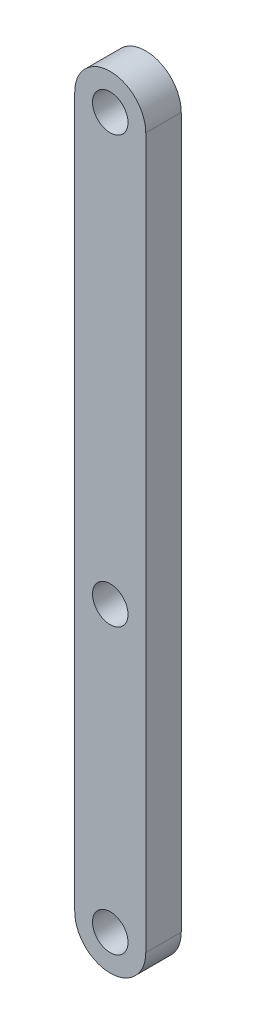
ISO-10303-21;
HEADER;
FILE_DESCRIPTION(('STEP AP214'),'2;1');
FILE_NAME('part.step','',(''),(''),'','','');
FILE_SCHEMA(('AUTOMOTIVE_DESIGN { 1 0 10303 214 1 1 1 1 }'));
ENDSEC;
DATA;
#1=APPLICATION_CONTEXT('core data for automotive mechanical design processes');
#2=APPLICATION_PROTOCOL_DEFINITION('international standard','automotive_design',2000,#1);
#3=PRODUCT_CONTEXT('',#1,'mechanical');
#4=PRODUCT('Part','Part','',(#3));
#5=PRODUCT_RELATED_PRODUCT_CATEGORY('part','',(#4));
#6=PRODUCT_DEFINITION_FORMATION('','',#4);
#7=PRODUCT_DEFINITION_CONTEXT('part definition',#1,'design');
#8=PRODUCT_DEFINITION('design','',#6,#7);
#9=PRODUCT_DEFINITION_SHAPE('','',#8);
#10=(LENGTH_UNIT() NAMED_UNIT(*) SI_UNIT(.MILLI.,.METRE.));
#11=(NAMED_UNIT(*) PLANE_ANGLE_UNIT() SI_UNIT($,.RADIAN.));
#12=(NAMED_UNIT(*) SI_UNIT($,.STERADIAN.) SOLID_ANGLE_UNIT());
#13=UNCERTAINTY_MEASURE_WITH_UNIT(LENGTH_MEASURE(1.E-05),#10,'distance_accuracy_value','');
#14=(GEOMETRIC_REPRESENTATION_CONTEXT(3) GLOBAL_UNCERTAINTY_ASSIGNED_CONTEXT((#13)) GLOBAL_UNIT_ASSIGNED_CONTEXT((#10,
#11,#12)) REPRESENTATION_CONTEXT('',''));
#15=CARTESIAN_POINT('',(0.,0.,0.));
#16=DIRECTION('',(0.,0.,1.));
#17=DIRECTION('',(1.,0.,0.));
#18=AXIS2_PLACEMENT_3D('',#15,#16,#17);
#19=CARTESIAN_POINT('',(0.,-40.,2.));
#20=DIRECTION('',(0.,0.,1.));
#21=DIRECTION('',(1.,0.,0.));
#22=AXIS2_PLACEMENT_3D('',#19,#20,#21);
#23=PLANE('',#22);
#24=CARTESIAN_POINT('',(0.,-40.,2.));
#25=DIRECTION('',(0.,0.,1.));
#26=DIRECTION('',(1.,0.,0.));
#27=AXIS2_PLACEMENT_3D('',#24,#25,#26);
#28=CIRCLE('',#27,1.);
#29=CARTESIAN_POINT('',(1.00000000000001,-40.,2.));
#30=VERTEX_POINT('',#29);
#31=EDGE_CURVE('E134',#30,#30,#28,.T.);
#32=ORIENTED_EDGE('',*,*,#31,.F.);
#33=EDGE_LOOP('',(#32));
#34=FACE_BOUND('',#33,.T.);
#35=CARTESIAN_POINT('',(0.,-40.,2.));
#36=DIRECTION('',(0.,0.,1.));
#37=DIRECTION('',(1.,0.,0.));
#38=AXIS2_PLACEMENT_3D('',#35,#36,#37);
#39=CIRCLE('',#38,2.);
#40=CARTESIAN_POINT('',(-2.,-40.,2.));
#41=VERTEX_POINT('',#40);
#42=CARTESIAN_POINT('',(2.00000000000001,-40.,2.));
#43=VERTEX_POINT('',#42);
#44=EDGE_CURVE('E92',#41,#43,#39,.T.);
#45=ORIENTED_EDGE('',*,*,#44,.T.);
#46=DIRECTION('',(0.,1.,0.));
#47=VECTOR('',#46,1.);
#48=CARTESIAN_POINT('',(2.,0.,2.));
#49=LINE('',#48,#47);
#50=CARTESIAN_POINT('',(2.,0.,2.));
#51=VERTEX_POINT('',#50);
#52=EDGE_CURVE('E87',#43,#51,#49,.T.);
#53=ORIENTED_EDGE('',*,*,#52,.T.);
#54=CARTESIAN_POINT('',(0.,0.,2.));
#55=DIRECTION('',(0.,0.,1.));
#56=DIRECTION('',(1.,0.,0.));
#57=AXIS2_PLACEMENT_3D('',#54,#55,#56);
#58=CIRCLE('',#57,2.);
#59=CARTESIAN_POINT('',(-2.,0.,2.));
#60=VERTEX_POINT('',#59);
#61=EDGE_CURVE('E90',#51,#60,#58,.T.);
#62=ORIENTED_EDGE('',*,*,#61,.T.);
#63=DIRECTION('',(0.,-1.,0.));
#64=VECTOR('',#63,1.);
#65=CARTESIAN_POINT('',(-2.,-40.,2.));
#66=LINE('',#65,#64);
#67=EDGE_CURVE('E57',#60,#41,#66,.T.);
#68=ORIENTED_EDGE('',*,*,#67,.T.);
#69=EDGE_LOOP('',(#45,#53,#62,#68));
#70=FACE_BOUND('',#69,.T.);
#71=CARTESIAN_POINT('',(0.,0.,2.));
#72=DIRECTION('',(0.,0.,1.));
#73=DIRECTION('',(1.,0.,0.));
#74=AXIS2_PLACEMENT_3D('',#71,#72,#73);
#75=CIRCLE('',#74,1.);
#76=CARTESIAN_POINT('',(1.,0.,2.));
#77=VERTEX_POINT('',#76);
#78=EDGE_CURVE('E112',#77,#77,#75,.T.);
#79=ORIENTED_EDGE('',*,*,#78,.F.);
#80=EDGE_LOOP('',(#79));
#81=FACE_BOUND('',#80,.T.);
#82=CARTESIAN_POINT('',(0.,-24.,2.));
#83=DIRECTION('',(0.,0.,1.));
#84=DIRECTION('',(1.,0.,0.));
#85=AXIS2_PLACEMENT_3D('',#82,#83,#84);
#86=CIRCLE('',#85,1.);
#87=CARTESIAN_POINT('',(1.00000000000001,-24.,2.));
#88=VERTEX_POINT('',#87);
#89=EDGE_CURVE('E142',#88,#88,#86,.T.);
#90=ORIENTED_EDGE('',*,*,#89,.F.);
#91=EDGE_LOOP('',(#90));
#92=FACE_BOUND('',#91,.T.);
#93=ADVANCED_FACE('F39',(#34,#70,#81,#92),#23,.T.);
#94=CARTESIAN_POINT('',(0.,-40.,0.));
#95=DIRECTION('',(0.,0.,1.));
#96=DIRECTION('',(1.,0.,0.));
#97=AXIS2_PLACEMENT_3D('',#94,#95,#96);
#98=PLANE('',#97);
#99=CARTESIAN_POINT('',(0.,-40.,0.));
#100=DIRECTION('',(0.,0.,1.));
#101=DIRECTION('',(1.,0.,0.));
#102=AXIS2_PLACEMENT_3D('',#99,#100,#101);
#103=CIRCLE('',#102,2.);
#104=CARTESIAN_POINT('',(-2.,-40.,0.));
#105=VERTEX_POINT('',#104);
#106=CARTESIAN_POINT('',(2.00000000000001,-40.,0.));
#107=VERTEX_POINT('',#106);
#108=EDGE_CURVE('E108',#105,#107,#103,.T.);
#109=ORIENTED_EDGE('',*,*,#108,.F.);
#110=DIRECTION('',(0.,-1.,0.));
#111=VECTOR('',#110,1.);
#112=CARTESIAN_POINT('',(-2.,-40.,0.));
#113=LINE('',#112,#111);
#114=CARTESIAN_POINT('',(-2.,0.,0.));
#115=VERTEX_POINT('',#114);
#116=EDGE_CURVE('E80',#115,#105,#113,.T.);
#117=ORIENTED_EDGE('',*,*,#116,.F.);
#118=CARTESIAN_POINT('',(0.,0.,0.));
#119=DIRECTION('',(0.,0.,1.));
#120=DIRECTION('',(1.,0.,0.));
#121=AXIS2_PLACEMENT_3D('',#118,#119,#120);
#122=CIRCLE('',#121,2.);
#123=CARTESIAN_POINT('',(2.,0.,0.));
#124=VERTEX_POINT('',#123);
#125=EDGE_CURVE('E74',#124,#115,#122,.T.);
#126=ORIENTED_EDGE('',*,*,#125,.F.);
#127=DIRECTION('',(0.,1.,0.));
#128=VECTOR('',#127,1.);
#129=CARTESIAN_POINT('',(2.,0.,0.));
#130=LINE('',#129,#128);
#131=EDGE_CURVE('E97',#107,#124,#130,.T.);
#132=ORIENTED_EDGE('',*,*,#131,.F.);
#133=EDGE_LOOP('',(#109,#117,#126,#132));
#134=FACE_BOUND('',#133,.T.);
#135=CARTESIAN_POINT('',(0.,0.,0.));
#136=DIRECTION('',(0.,0.,1.));
#137=DIRECTION('',(1.,0.,0.));
#138=AXIS2_PLACEMENT_3D('',#135,#136,#137);
#139=CIRCLE('',#138,1.);
#140=CARTESIAN_POINT('',(1.,0.,0.));
#141=VERTEX_POINT('',#140);
#142=EDGE_CURVE('E130',#141,#141,#139,.T.);
#143=ORIENTED_EDGE('',*,*,#142,.T.);
#144=EDGE_LOOP('',(#143));
#145=FACE_BOUND('',#144,.T.);
#146=CARTESIAN_POINT('',(0.,-40.,0.));
#147=DIRECTION('',(0.,0.,1.));
#148=DIRECTION('',(1.,0.,0.));
#149=AXIS2_PLACEMENT_3D('',#146,#147,#148);
#150=CIRCLE('',#149,1.);
#151=CARTESIAN_POINT('',(1.00000000000001,-40.,0.));
#152=VERTEX_POINT('',#151);
#153=EDGE_CURVE('E138',#152,#152,#150,.T.);
#154=ORIENTED_EDGE('',*,*,#153,.T.);
#155=EDGE_LOOP('',(#154));
#156=FACE_BOUND('',#155,.T.);
#157=CARTESIAN_POINT('',(0.,-24.,0.));
#158=DIRECTION('',(0.,0.,1.));
#159=DIRECTION('',(1.,0.,0.));
#160=AXIS2_PLACEMENT_3D('',#157,#158,#159);
#161=CIRCLE('',#160,1.);
#162=CARTESIAN_POINT('',(1.00000000000001,-24.,0.));
#163=VERTEX_POINT('',#162);
#164=EDGE_CURVE('E146',#163,#163,#161,.T.);
#165=ORIENTED_EDGE('',*,*,#164,.T.);
#166=EDGE_LOOP('',(#165));
#167=FACE_BOUND('',#166,.T.);
#168=ADVANCED_FACE('F125',(#134,#145,#156,#167),#98,.F.);
#169=CARTESIAN_POINT('',(0.,-40.,2.));
#170=DIRECTION('',(0.,0.,-1.));
#171=DIRECTION('',(-1.,0.,0.));
#172=AXIS2_PLACEMENT_3D('',#169,#170,#171);
#173=CYLINDRICAL_SURFACE('',#172,2.);
#174=ORIENTED_EDGE('',*,*,#108,.T.);
#175=DIRECTION('',(0.,0.,-1.));
#176=VECTOR('',#175,1.);
#177=CARTESIAN_POINT('',(2.00000000000001,-40.,2.));
#178=LINE('',#177,#176);
#179=EDGE_CURVE('E11',#43,#107,#178,.T.);
#180=ORIENTED_EDGE('',*,*,#179,.F.);
#181=ORIENTED_EDGE('',*,*,#44,.F.);
#182=DIRECTION('',(0.,0.,-1.));
#183=VECTOR('',#182,1.);
#184=CARTESIAN_POINT('',(-2.,-40.,2.));
#185=LINE('',#184,#183);
#186=EDGE_CURVE('E104',#41,#105,#185,.T.);
#187=ORIENTED_EDGE('',*,*,#186,.T.);
#188=EDGE_LOOP('',(#174,#180,#181,#187));
#189=FACE_BOUND('',#188,.T.);
#190=ADVANCED_FACE('F41',(#189),#173,.T.);
#191=CARTESIAN_POINT('',(2.,0.,2.));
#192=DIRECTION('',(-1.,0.,0.));
#193=DIRECTION('',(0.,-1.,0.));
#194=AXIS2_PLACEMENT_3D('',#191,#192,#193);
#195=PLANE('',#194);
#196=ORIENTED_EDGE('',*,*,#131,.T.);
#197=DIRECTION('',(0.,0.,-1.));
#198=VECTOR('',#197,1.);
#199=CARTESIAN_POINT('',(2.,0.,2.));
#200=LINE('',#199,#198);
#201=EDGE_CURVE('E49',#51,#124,#200,.T.);
#202=ORIENTED_EDGE('',*,*,#201,.F.);
#203=ORIENTED_EDGE('',*,*,#52,.F.);
#204=ORIENTED_EDGE('',*,*,#179,.T.);
#205=EDGE_LOOP('',(#196,#202,#203,#204));
#206=FACE_BOUND('',#205,.T.);
#207=ADVANCED_FACE('F96',(#206),#195,.F.);
#208=CARTESIAN_POINT('',(0.,0.,2.));
#209=DIRECTION('',(0.,0.,-1.));
#210=DIRECTION('',(-1.,0.,0.));
#211=AXIS2_PLACEMENT_3D('',#208,#209,#210);
#212=CYLINDRICAL_SURFACE('',#211,2.);
#213=ORIENTED_EDGE('',*,*,#125,.T.);
#214=DIRECTION('',(0.,0.,-1.));
#215=VECTOR('',#214,1.);
#216=CARTESIAN_POINT('',(-2.,0.,2.));
#217=LINE('',#216,#215);
#218=EDGE_CURVE('E99',#60,#115,#217,.T.);
#219=ORIENTED_EDGE('',*,*,#218,.F.);
#220=ORIENTED_EDGE('',*,*,#61,.F.);
#221=ORIENTED_EDGE('',*,*,#201,.T.);
#222=EDGE_LOOP('',(#213,#219,#220,#221));
#223=FACE_BOUND('',#222,.T.);
#224=ADVANCED_FACE('F100',(#223),#212,.T.);
#225=CARTESIAN_POINT('',(-2.,-40.,2.));
#226=DIRECTION('',(1.,0.,0.));
#227=DIRECTION('',(0.,1.,0.));
#228=AXIS2_PLACEMENT_3D('',#225,#226,#227);
#229=PLANE('',#228);
#230=ORIENTED_EDGE('',*,*,#116,.T.);
#231=ORIENTED_EDGE('',*,*,#186,.F.);
#232=ORIENTED_EDGE('',*,*,#67,.F.);
#233=ORIENTED_EDGE('',*,*,#218,.T.);
#234=EDGE_LOOP('',(#230,#231,#232,#233));
#235=FACE_BOUND('',#234,.T.);
#236=ADVANCED_FACE('F122',(#235),#229,.F.);
#237=CARTESIAN_POINT('',(0.,0.,2.));
#238=DIRECTION('',(0.,0.,-1.));
#239=DIRECTION('',(-1.,0.,0.));
#240=AXIS2_PLACEMENT_3D('',#237,#238,#239);
#241=CYLINDRICAL_SURFACE('',#240,1.);
#242=ORIENTED_EDGE('',*,*,#78,.T.);
#243=EDGE_LOOP('',(#242));
#244=FACE_BOUND('',#243,.T.);
#245=ORIENTED_EDGE('',*,*,#142,.F.);
#246=EDGE_LOOP('',(#245));
#247=FACE_BOUND('',#246,.T.);
#248=ADVANCED_FACE('F166',(#244,#247),#241,.F.);
#249=CARTESIAN_POINT('',(0.,-40.,2.));
#250=DIRECTION('',(0.,0.,-1.));
#251=DIRECTION('',(-1.,0.,0.));
#252=AXIS2_PLACEMENT_3D('',#249,#250,#251);
#253=CYLINDRICAL_SURFACE('',#252,1.);
#254=ORIENTED_EDGE('',*,*,#31,.T.);
#255=EDGE_LOOP('',(#254));
#256=FACE_BOUND('',#255,.T.);
#257=ORIENTED_EDGE('',*,*,#153,.F.);
#258=EDGE_LOOP('',(#257));
#259=FACE_BOUND('',#258,.T.);
#260=ADVANCED_FACE('F212',(#256,#259),#253,.F.);
#261=CARTESIAN_POINT('',(0.,-24.,2.));
#262=DIRECTION('',(0.,0.,-1.));
#263=DIRECTION('',(-1.,0.,0.));
#264=AXIS2_PLACEMENT_3D('',#261,#262,#263);
#265=CYLINDRICAL_SURFACE('',#264,1.);
#266=ORIENTED_EDGE('',*,*,#89,.T.);
#267=EDGE_LOOP('',(#266));
#268=FACE_BOUND('',#267,.T.);
#269=ORIENTED_EDGE('',*,*,#164,.F.);
#270=EDGE_LOOP('',(#269));
#271=FACE_BOUND('',#270,.T.);
#272=ADVANCED_FACE('F154',(#268,#271),#265,.F.);
#273=CLOSED_SHELL('',(#93,#168,#190,#207,#224,#236,#248,#260,#272));
#274=MANIFOLD_SOLID_BREP('B2',#273);
#275=ADVANCED_BREP_SHAPE_REPRESENTATION('',(#18,#274),#14);
#276=SHAPE_DEFINITION_REPRESENTATION(#9,#275);
ENDSEC;
END-ISO-10303-21;
